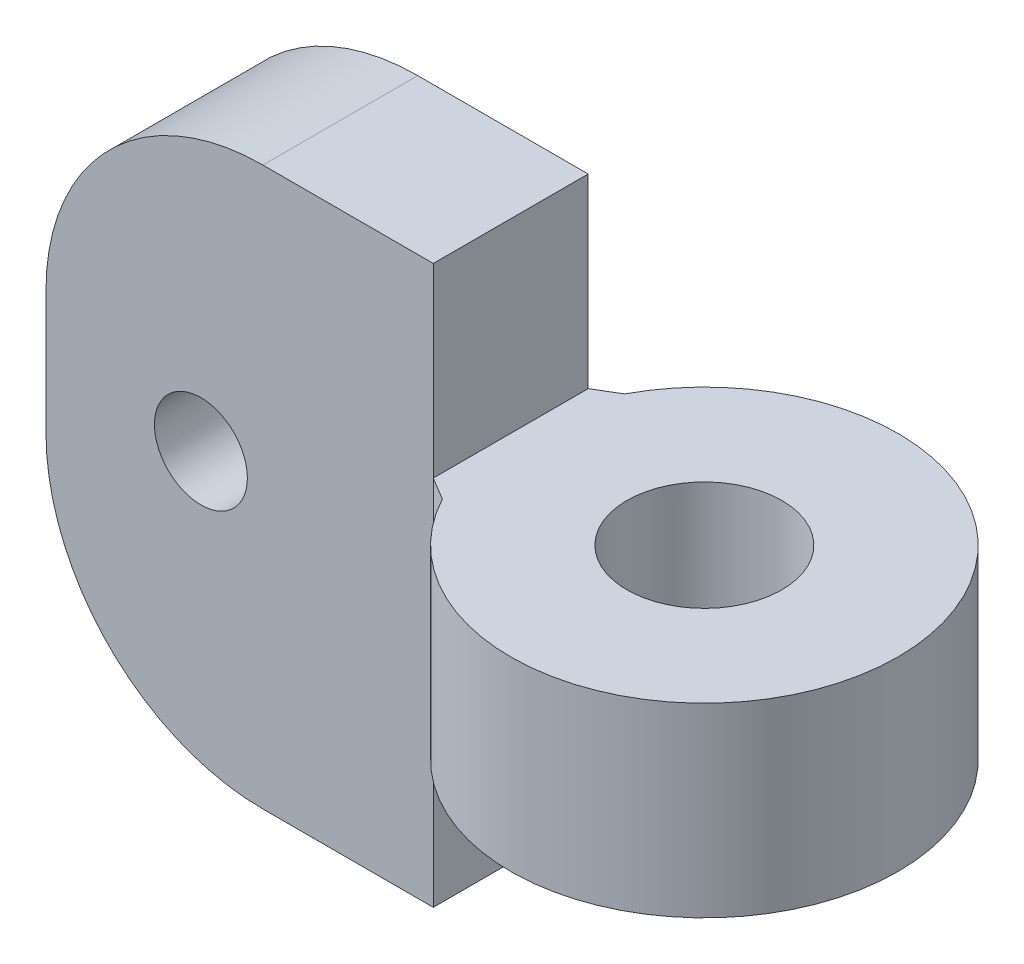
ISO-10303-21;
HEADER;
FILE_DESCRIPTION(('STEP AP214'),'2;1');
FILE_NAME('part.step','',(''),(''),'','','');
FILE_SCHEMA(('AUTOMOTIVE_DESIGN { 1 0 10303 214 1 1 1 1 }'));
ENDSEC;
DATA;
#1=APPLICATION_CONTEXT('core data for automotive mechanical design processes');
#2=APPLICATION_PROTOCOL_DEFINITION('international standard','automotive_design',2000,#1);
#3=PRODUCT_CONTEXT('',#1,'mechanical');
#4=PRODUCT('Part','Part','',(#3));
#5=PRODUCT_RELATED_PRODUCT_CATEGORY('part','',(#4));
#6=PRODUCT_DEFINITION_FORMATION('','',#4);
#7=PRODUCT_DEFINITION_CONTEXT('part definition',#1,'design');
#8=PRODUCT_DEFINITION('design','',#6,#7);
#9=PRODUCT_DEFINITION_SHAPE('','',#8);
#10=(LENGTH_UNIT() NAMED_UNIT(*) SI_UNIT(.MILLI.,.METRE.));
#11=(NAMED_UNIT(*) PLANE_ANGLE_UNIT() SI_UNIT($,.RADIAN.));
#12=(NAMED_UNIT(*) SI_UNIT($,.STERADIAN.) SOLID_ANGLE_UNIT());
#13=UNCERTAINTY_MEASURE_WITH_UNIT(LENGTH_MEASURE(1.E-05),#10,'distance_accuracy_value','');
#14=(GEOMETRIC_REPRESENTATION_CONTEXT(3) GLOBAL_UNCERTAINTY_ASSIGNED_CONTEXT((#13)) GLOBAL_UNIT_ASSIGNED_CONTEXT((#10,
#11,#12)) REPRESENTATION_CONTEXT('',''));
#15=CARTESIAN_POINT('',(0.,0.,0.));
#16=DIRECTION('',(0.,0.,1.));
#17=DIRECTION('',(1.,0.,0.));
#18=AXIS2_PLACEMENT_3D('',#15,#16,#17);
#19=CARTESIAN_POINT('',(11.25,5.1,15.));
#20=DIRECTION('',(-1.,0.,0.));
#21=DIRECTION('',(0.,0.,1.));
#22=AXIS2_PLACEMENT_3D('',#19,#20,#21);
#23=PLANE('',#22);
#24=DIRECTION('',(0.,1.,0.));
#25=VECTOR('',#24,1.);
#26=CARTESIAN_POINT('',(11.25,-4.9,5.));
#27=LINE('',#26,#25);
#28=CARTESIAN_POINT('',(11.25,-0.9,5.));
#29=VERTEX_POINT('',#28);
#30=CARTESIAN_POINT('',(11.25,5.1,5.));
#31=VERTEX_POINT('',#30);
#32=EDGE_CURVE('E157',#29,#31,#27,.T.);
#33=ORIENTED_EDGE('',*,*,#32,.T.);
#34=DIRECTION('',(0.,0.,-1.));
#35=VECTOR('',#34,1.);
#36=CARTESIAN_POINT('',(11.25,5.1,15.));
#37=LINE('',#36,#35);
#38=CARTESIAN_POINT('',(11.25,5.1,10.));
#39=VERTEX_POINT('',#38);
#40=EDGE_CURVE('E174',#39,#31,#37,.T.);
#41=ORIENTED_EDGE('',*,*,#40,.F.);
#42=DIRECTION('',(0.,1.,0.));
#43=VECTOR('',#42,1.);
#44=CARTESIAN_POINT('',(11.25,-4.9,10.));
#45=LINE('',#44,#43);
#46=CARTESIAN_POINT('',(11.25,-0.9,10.));
#47=VERTEX_POINT('',#46);
#48=EDGE_CURVE('E208',#47,#39,#45,.T.);
#49=ORIENTED_EDGE('',*,*,#48,.F.);
#50=DIRECTION('',(0.,0.,-1.));
#51=VECTOR('',#50,1.);
#52=CARTESIAN_POINT('',(11.25,-0.9,15.));
#53=LINE('',#52,#51);
#54=EDGE_CURVE('E183',#47,#29,#53,.T.);
#55=ORIENTED_EDGE('',*,*,#54,.T.);
#56=EDGE_LOOP('',(#33,#41,#49,#55));
#57=FACE_BOUND('',#56,.T.);
#58=ADVANCED_FACE('F69',(#57),#23,.F.);
#59=CARTESIAN_POINT('',(11.25,17.1,15.));
#60=DIRECTION('',(-1.,0.,0.));
#61=DIRECTION('',(0.,-1.,0.));
#62=AXIS2_PLACEMENT_3D('',#59,#60,#61);
#63=PLANE('',#62);
#64=CARTESIAN_POINT('',(11.25,11.1,5.));
#65=VERTEX_POINT('',#64);
#66=CARTESIAN_POINT('',(11.25,17.1,5.));
#67=VERTEX_POINT('',#66);
#68=EDGE_CURVE('E148',#65,#67,#27,.T.);
#69=ORIENTED_EDGE('',*,*,#68,.T.);
#70=DIRECTION('',(0.,0.,-1.));
#71=VECTOR('',#70,1.);
#72=CARTESIAN_POINT('',(11.25,17.1,15.));
#73=LINE('',#72,#71);
#74=CARTESIAN_POINT('',(11.25,17.1,10.));
#75=VERTEX_POINT('',#74);
#76=EDGE_CURVE('E164',#75,#67,#73,.T.);
#77=ORIENTED_EDGE('',*,*,#76,.F.);
#78=CARTESIAN_POINT('',(11.25,11.1,10.));
#79=VERTEX_POINT('',#78);
#80=EDGE_CURVE('E217',#79,#75,#45,.T.);
#81=ORIENTED_EDGE('',*,*,#80,.F.);
#82=DIRECTION('',(0.,0.,-1.));
#83=VECTOR('',#82,1.);
#84=CARTESIAN_POINT('',(11.25,11.1,15.));
#85=LINE('',#84,#83);
#86=EDGE_CURVE('E166',#79,#65,#85,.T.);
#87=ORIENTED_EDGE('',*,*,#86,.T.);
#88=EDGE_LOOP('',(#69,#77,#81,#87));
#89=FACE_BOUND('',#88,.T.);
#90=ADVANCED_FACE('F162',(#89),#63,.F.);
#91=CARTESIAN_POINT('',(23.75,5.1,15.));
#92=DIRECTION('',(0.,1.,0.));
#93=DIRECTION('',(-1.,0.,0.));
#94=AXIS2_PLACEMENT_3D('',#91,#92,#93);
#95=PLANE('',#94);
#96=CARTESIAN_POINT('',(17.5,5.1,7.5));
#97=DIRECTION('',(0.,1.,0.));
#98=DIRECTION('',(-1.,0.,0.));
#99=AXIS2_PLACEMENT_3D('',#96,#97,#98);
#100=CIRCLE('',#99,2.5);
#101=CARTESIAN_POINT('',(15.,5.1,7.5));
#102=VERTEX_POINT('',#101);
#103=EDGE_CURVE('E172',#102,#102,#100,.F.);
#104=ORIENTED_EDGE('',*,*,#103,.F.);
#105=EDGE_LOOP('',(#104));
#106=FACE_BOUND('',#105,.T.);
#107=DIRECTION('',(-0.857492925712544,0.,0.514495755427527));
#108=VECTOR('',#107,1.);
#109=CARTESIAN_POINT('',(16.0294117647059,5.1,2.13235294117647));
#110=LINE('',#109,#108);
#111=CARTESIAN_POINT('',(11.985294117647,5.1,4.55882352941178));
#112=VERTEX_POINT('',#111);
#113=EDGE_CURVE('E156',#112,#31,#110,.T.);
#114=ORIENTED_EDGE('',*,*,#113,.F.);
#115=CARTESIAN_POINT('',(17.5,5.1,7.5));
#116=DIRECTION('',(0.,1.,0.));
#117=DIRECTION('',(-1.,0.,0.));
#118=AXIS2_PLACEMENT_3D('',#115,#116,#117);
#119=CIRCLE('',#118,6.25);
#120=CARTESIAN_POINT('',(11.9852941176471,5.1,10.4411764705882));
#121=VERTEX_POINT('',#120);
#122=EDGE_CURVE('E198',#121,#112,#119,.T.);
#123=ORIENTED_EDGE('',*,*,#122,.F.);
#124=DIRECTION('',(-0.857492925712545,0.,-0.514495755427524));
#125=VECTOR('',#124,1.);
#126=CARTESIAN_POINT('',(22.6470588235294,5.1,16.8382352941176));
#127=LINE('',#126,#125);
#128=EDGE_CURVE('E226',#121,#39,#127,.T.);
#129=ORIENTED_EDGE('',*,*,#128,.T.);
#130=ORIENTED_EDGE('',*,*,#40,.T.);
#131=EDGE_LOOP('',(#114,#123,#129,#130));
#132=FACE_BOUND('',#131,.T.);
#133=ADVANCED_FACE('F240',(#106,#132),#95,.F.);
#134=CARTESIAN_POINT('',(11.25,11.1,15.));
#135=DIRECTION('',(0.,-1.,0.));
#136=DIRECTION('',(0.,0.,-1.));
#137=AXIS2_PLACEMENT_3D('',#134,#135,#136);
#138=PLANE('',#137);
#139=CARTESIAN_POINT('',(17.5,11.1,7.5));
#140=DIRECTION('',(0.,-1.,0.));
#141=DIRECTION('',(0.,0.,-1.));
#142=AXIS2_PLACEMENT_3D('',#139,#140,#141);
#143=CIRCLE('',#142,2.5);
#144=CARTESIAN_POINT('',(17.5,11.1,5.));
#145=VERTEX_POINT('',#144);
#146=EDGE_CURVE('E177',#145,#145,#143,.F.);
#147=ORIENTED_EDGE('',*,*,#146,.F.);
#148=EDGE_LOOP('',(#147));
#149=FACE_BOUND('',#148,.T.);
#150=DIRECTION('',(0.857492925712544,0.,-0.514495755427527));
#151=VECTOR('',#150,1.);
#152=CARTESIAN_POINT('',(6.83823529411765,11.1,7.64705882352942));
#153=LINE('',#152,#151);
#154=CARTESIAN_POINT('',(11.985294117647,11.1,4.55882352941178));
#155=VERTEX_POINT('',#154);
#156=EDGE_CURVE('E12',#65,#155,#153,.T.);
#157=ORIENTED_EDGE('',*,*,#156,.F.);
#158=ORIENTED_EDGE('',*,*,#86,.F.);
#159=DIRECTION('',(0.857492925712546,0.,0.514495755427524));
#160=VECTOR('',#159,1.);
#161=CARTESIAN_POINT('',(13.4558823529412,11.1,11.3235294117647));
#162=LINE('',#161,#160);
#163=CARTESIAN_POINT('',(11.9852941176471,11.1,10.4411764705882));
#164=VERTEX_POINT('',#163);
#165=EDGE_CURVE('E224',#79,#164,#162,.T.);
#166=ORIENTED_EDGE('',*,*,#165,.T.);
#167=CARTESIAN_POINT('',(17.5,11.1,7.5));
#168=DIRECTION('',(0.,-1.,0.));
#169=DIRECTION('',(0.,0.,-1.));
#170=AXIS2_PLACEMENT_3D('',#167,#168,#169);
#171=CIRCLE('',#170,6.25);
#172=EDGE_CURVE('E229',#155,#164,#171,.T.);
#173=ORIENTED_EDGE('',*,*,#172,.F.);
#174=EDGE_LOOP('',(#157,#158,#166,#173));
#175=FACE_BOUND('',#174,.T.);
#176=ADVANCED_FACE('F273',(#149,#175),#138,.F.);
#177=CARTESIAN_POINT('',(5.75000000000005,17.1,15.));
#178=DIRECTION('',(0.,-1.,0.));
#179=DIRECTION('',(0.,0.,-1.));
#180=AXIS2_PLACEMENT_3D('',#177,#178,#179);
#181=PLANE('',#180);
#182=ORIENTED_EDGE('',*,*,#76,.T.);
#183=DIRECTION('',(1.,0.,0.));
#184=VECTOR('',#183,1.);
#185=CARTESIAN_POINT('',(0.,17.1,5.));
#186=LINE('',#185,#184);
#187=CARTESIAN_POINT('',(5.75,17.1,5.));
#188=VERTEX_POINT('',#187);
#189=EDGE_CURVE('E144',#188,#67,#186,.T.);
#190=ORIENTED_EDGE('',*,*,#189,.F.);
#191=DIRECTION('',(0.,0.,-1.));
#192=VECTOR('',#191,1.);
#193=CARTESIAN_POINT('',(5.75000000000005,17.1,15.));
#194=LINE('',#193,#192);
#195=CARTESIAN_POINT('',(5.75,17.1,10.));
#196=VERTEX_POINT('',#195);
#197=EDGE_CURVE('E78',#196,#188,#194,.T.);
#198=ORIENTED_EDGE('',*,*,#197,.F.);
#199=DIRECTION('',(1.,0.,0.));
#200=VECTOR('',#199,1.);
#201=CARTESIAN_POINT('',(0.,17.1,10.));
#202=LINE('',#201,#200);
#203=EDGE_CURVE('E171',#196,#75,#202,.T.);
#204=ORIENTED_EDGE('',*,*,#203,.T.);
#205=EDGE_LOOP('',(#182,#190,#198,#204));
#206=FACE_BOUND('',#205,.T.);
#207=ADVANCED_FACE('F71',(#206),#181,.F.);
#208=CARTESIAN_POINT('',(5.75,10.1,15.));
#209=DIRECTION('',(0.,0.,-1.));
#210=DIRECTION('',(-1.,0.,0.));
#211=AXIS2_PLACEMENT_3D('',#208,#209,#210);
#212=CYLINDRICAL_SURFACE('',#211,7.);
#213=ORIENTED_EDGE('',*,*,#197,.T.);
#214=CARTESIAN_POINT('',(5.75,10.1,5.));
#215=DIRECTION('',(0.,0.,1.));
#216=DIRECTION('',(1.,0.,0.));
#217=AXIS2_PLACEMENT_3D('',#214,#215,#216);
#218=CIRCLE('',#217,7.);
#219=CARTESIAN_POINT('',(-1.25,10.1,5.));
#220=VERTEX_POINT('',#219);
#221=EDGE_CURVE('E151',#188,#220,#218,.T.);
#222=ORIENTED_EDGE('',*,*,#221,.T.);
#223=DIRECTION('',(0.,0.,-1.));
#224=VECTOR('',#223,1.);
#225=CARTESIAN_POINT('',(-1.25,10.1,15.));
#226=LINE('',#225,#224);
#227=CARTESIAN_POINT('',(-1.25,10.1,10.));
#228=VERTEX_POINT('',#227);
#229=EDGE_CURVE('E192',#228,#220,#226,.T.);
#230=ORIENTED_EDGE('',*,*,#229,.F.);
#231=CARTESIAN_POINT('',(5.75,10.1,10.));
#232=DIRECTION('',(0.,0.,1.));
#233=DIRECTION('',(1.,0.,0.));
#234=AXIS2_PLACEMENT_3D('',#231,#232,#233);
#235=CIRCLE('',#234,7.);
#236=EDGE_CURVE('E85',#196,#228,#235,.T.);
#237=ORIENTED_EDGE('',*,*,#236,.F.);
#238=EDGE_LOOP('',(#213,#222,#230,#237));
#239=FACE_BOUND('',#238,.T.);
#240=ADVANCED_FACE('F255',(#239),#212,.T.);
#241=CARTESIAN_POINT('',(-1.25,6.10000000000005,15.));
#242=DIRECTION('',(1.,0.,0.));
#243=DIRECTION('',(0.,0.,-1.));
#244=AXIS2_PLACEMENT_3D('',#241,#242,#243);
#245=PLANE('',#244);
#246=ORIENTED_EDGE('',*,*,#229,.T.);
#247=DIRECTION('',(0.,-1.,0.));
#248=VECTOR('',#247,1.);
#249=CARTESIAN_POINT('',(-1.25,6.10000000000005,5.));
#250=LINE('',#249,#248);
#251=CARTESIAN_POINT('',(-1.25,6.10000000000005,5.));
#252=VERTEX_POINT('',#251);
#253=EDGE_CURVE('E251',#220,#252,#250,.T.);
#254=ORIENTED_EDGE('',*,*,#253,.T.);
#255=DIRECTION('',(0.,0.,-1.));
#256=VECTOR('',#255,1.);
#257=CARTESIAN_POINT('',(-1.25,6.10000000000005,15.));
#258=LINE('',#257,#256);
#259=CARTESIAN_POINT('',(-1.25,6.10000000000005,10.));
#260=VERTEX_POINT('',#259);
#261=EDGE_CURVE('E189',#260,#252,#258,.T.);
#262=ORIENTED_EDGE('',*,*,#261,.F.);
#263=DIRECTION('',(0.,-1.,0.));
#264=VECTOR('',#263,1.);
#265=CARTESIAN_POINT('',(-1.25,6.10000000000005,10.));
#266=LINE('',#265,#264);
#267=EDGE_CURVE('E89',#228,#260,#266,.T.);
#268=ORIENTED_EDGE('',*,*,#267,.F.);
#269=EDGE_LOOP('',(#246,#254,#262,#268));
#270=FACE_BOUND('',#269,.T.);
#271=ADVANCED_FACE('F257',(#270),#245,.F.);
#272=CARTESIAN_POINT('',(5.75,6.1,15.));
#273=DIRECTION('',(0.,0.,-1.));
#274=DIRECTION('',(-1.,0.,0.));
#275=AXIS2_PLACEMENT_3D('',#272,#273,#274);
#276=CYLINDRICAL_SURFACE('',#275,7.);
#277=ORIENTED_EDGE('',*,*,#261,.T.);
#278=CARTESIAN_POINT('',(5.75,6.1,5.));
#279=DIRECTION('',(0.,0.,1.));
#280=DIRECTION('',(1.,0.,0.));
#281=AXIS2_PLACEMENT_3D('',#278,#279,#280);
#282=CIRCLE('',#281,7.);
#283=CARTESIAN_POINT('',(5.75000000000005,-0.9,5.));
#284=VERTEX_POINT('',#283);
#285=EDGE_CURVE('E248',#252,#284,#282,.T.);
#286=ORIENTED_EDGE('',*,*,#285,.T.);
#287=DIRECTION('',(0.,0.,-1.));
#288=VECTOR('',#287,1.);
#289=CARTESIAN_POINT('',(5.75000000000005,-0.9,15.));
#290=LINE('',#289,#288);
#291=CARTESIAN_POINT('',(5.75000000000005,-0.9,10.));
#292=VERTEX_POINT('',#291);
#293=EDGE_CURVE('E186',#292,#284,#290,.T.);
#294=ORIENTED_EDGE('',*,*,#293,.F.);
#295=CARTESIAN_POINT('',(5.75,6.1,10.));
#296=DIRECTION('',(0.,0.,1.));
#297=DIRECTION('',(1.,0.,0.));
#298=AXIS2_PLACEMENT_3D('',#295,#296,#297);
#299=CIRCLE('',#298,7.);
#300=EDGE_CURVE('E205',#260,#292,#299,.T.);
#301=ORIENTED_EDGE('',*,*,#300,.F.);
#302=EDGE_LOOP('',(#277,#286,#294,#301));
#303=FACE_BOUND('',#302,.T.);
#304=ADVANCED_FACE('F260',(#303),#276,.T.);
#305=CARTESIAN_POINT('',(5.75000000000005,-0.9,15.));
#306=DIRECTION('',(0.,1.,0.));
#307=DIRECTION('',(0.,0.,1.));
#308=AXIS2_PLACEMENT_3D('',#305,#306,#307);
#309=PLANE('',#308);
#310=ORIENTED_EDGE('',*,*,#293,.T.);
#311=DIRECTION('',(1.,0.,0.));
#312=VECTOR('',#311,1.);
#313=CARTESIAN_POINT('',(5.75000000000005,-0.9,5.));
#314=LINE('',#313,#312);
#315=EDGE_CURVE('E244',#284,#29,#314,.T.);
#316=ORIENTED_EDGE('',*,*,#315,.T.);
#317=ORIENTED_EDGE('',*,*,#54,.F.);
#318=DIRECTION('',(1.,0.,0.));
#319=VECTOR('',#318,1.);
#320=CARTESIAN_POINT('',(5.75000000000005,-0.9,10.));
#321=LINE('',#320,#319);
#322=EDGE_CURVE('E201',#292,#47,#321,.T.);
#323=ORIENTED_EDGE('',*,*,#322,.F.);
#324=EDGE_LOOP('',(#310,#316,#317,#323));
#325=FACE_BOUND('',#324,.T.);
#326=ADVANCED_FACE('F267',(#325),#309,.F.);
#327=CARTESIAN_POINT('',(3.75,8.1,15.));
#328=DIRECTION('',(0.,0.,-1.));
#329=DIRECTION('',(-1.,0.,0.));
#330=AXIS2_PLACEMENT_3D('',#327,#328,#329);
#331=CYLINDRICAL_SURFACE('',#330,1.5);
#332=CARTESIAN_POINT('',(3.75,8.1,5.));
#333=DIRECTION('',(0.,0.,1.));
#334=DIRECTION('',(1.,0.,0.));
#335=AXIS2_PLACEMENT_3D('',#332,#333,#334);
#336=CIRCLE('',#335,1.5);
#337=CARTESIAN_POINT('',(5.25,8.1,5.));
#338=VERTEX_POINT('',#337);
#339=EDGE_CURVE('E73',#338,#338,#336,.T.);
#340=ORIENTED_EDGE('',*,*,#339,.F.);
#341=EDGE_LOOP('',(#340));
#342=FACE_BOUND('',#341,.T.);
#343=CARTESIAN_POINT('',(3.75,8.1,10.));
#344=DIRECTION('',(0.,0.,1.));
#345=DIRECTION('',(1.,0.,0.));
#346=AXIS2_PLACEMENT_3D('',#343,#344,#345);
#347=CIRCLE('',#346,1.5);
#348=CARTESIAN_POINT('',(5.25,8.1,10.));
#349=VERTEX_POINT('',#348);
#350=EDGE_CURVE('E199',#349,#349,#347,.T.);
#351=ORIENTED_EDGE('',*,*,#350,.T.);
#352=EDGE_LOOP('',(#351));
#353=FACE_BOUND('',#352,.T.);
#354=ADVANCED_FACE('F293',(#342,#353),#331,.F.);
#355=CARTESIAN_POINT('',(17.5,20.,7.5));
#356=DIRECTION('',(0.,-1.,0.));
#357=DIRECTION('',(0.,0.,-1.));
#358=AXIS2_PLACEMENT_3D('',#355,#356,#357);
#359=CYLINDRICAL_SURFACE('',#358,2.5);
#360=ORIENTED_EDGE('',*,*,#146,.T.);
#361=EDGE_LOOP('',(#360));
#362=FACE_BOUND('',#361,.T.);
#363=ORIENTED_EDGE('',*,*,#103,.T.);
#364=EDGE_LOOP('',(#363));
#365=FACE_BOUND('',#364,.T.);
#366=ADVANCED_FACE('F320',(#362,#365),#359,.F.);
#367=CARTESIAN_POINT('',(17.5,20.,7.5));
#368=DIRECTION('',(0.,-1.,0.));
#369=DIRECTION('',(0.,0.,-1.));
#370=AXIS2_PLACEMENT_3D('',#367,#368,#369);
#371=CYLINDRICAL_SURFACE('',#370,6.25);
#372=ORIENTED_EDGE('',*,*,#122,.T.);
#373=DIRECTION('',(0.,1.,0.));
#374=VECTOR('',#373,1.);
#375=CARTESIAN_POINT('',(11.985294117647,-4.9,4.55882352941178));
#376=LINE('',#375,#374);
#377=EDGE_CURVE('E168',#112,#155,#376,.T.);
#378=ORIENTED_EDGE('',*,*,#377,.T.);
#379=ORIENTED_EDGE('',*,*,#172,.T.);
#380=DIRECTION('',(0.,1.,0.));
#381=VECTOR('',#380,1.);
#382=CARTESIAN_POINT('',(11.9852941176471,-4.9,10.4411764705882));
#383=LINE('',#382,#381);
#384=EDGE_CURVE('E202',#121,#164,#383,.T.);
#385=ORIENTED_EDGE('',*,*,#384,.F.);
#386=EDGE_LOOP('',(#372,#378,#379,#385));
#387=FACE_BOUND('',#386,.T.);
#388=ADVANCED_FACE('F233',(#387),#371,.T.);
#389=CARTESIAN_POINT('',(-1.43382352941178,-4.9,2.38970588235298));
#390=DIRECTION('',(0.514495755427524,0.,-0.857492925712546));
#391=DIRECTION('',(-0.857492925712546,0.,-0.514495755427524));
#392=AXIS2_PLACEMENT_3D('',#389,#390,#391);
#393=PLANE('',#392);
#394=ORIENTED_EDGE('',*,*,#384,.T.);
#395=ORIENTED_EDGE('',*,*,#165,.F.);
#396=EDGE_CURVE('E215',#39,#79,#45,.T.);
#397=ORIENTED_EDGE('',*,*,#396,.F.);
#398=ORIENTED_EDGE('',*,*,#128,.F.);
#399=EDGE_LOOP('',(#394,#395,#397,#398));
#400=FACE_BOUND('',#399,.T.);
#401=ADVANCED_FACE('F271',(#400),#393,.F.);
#402=CARTESIAN_POINT('',(0.,-4.9,10.));
#403=DIRECTION('',(0.,0.,1.));
#404=DIRECTION('',(1.,0.,0.));
#405=AXIS2_PLACEMENT_3D('',#402,#403,#404);
#406=PLANE('',#405);
#407=ORIENTED_EDGE('',*,*,#350,.F.);
#408=EDGE_LOOP('',(#407));
#409=FACE_BOUND('',#408,.T.);
#410=ORIENTED_EDGE('',*,*,#236,.T.);
#411=ORIENTED_EDGE('',*,*,#267,.T.);
#412=ORIENTED_EDGE('',*,*,#300,.T.);
#413=ORIENTED_EDGE('',*,*,#322,.T.);
#414=ORIENTED_EDGE('',*,*,#48,.T.);
#415=ORIENTED_EDGE('',*,*,#396,.T.);
#416=ORIENTED_EDGE('',*,*,#80,.T.);
#417=ORIENTED_EDGE('',*,*,#203,.F.);
#418=EDGE_LOOP('',(#410,#411,#412,#413,#414,#415,#416,#417));
#419=FACE_BOUND('',#418,.T.);
#420=ADVANCED_FACE('F263',(#409,#419),#406,.T.);
#421=CARTESIAN_POINT('',(0.,-4.9,5.));
#422=DIRECTION('',(0.,0.,1.));
#423=DIRECTION('',(1.,0.,0.));
#424=AXIS2_PLACEMENT_3D('',#421,#422,#423);
#425=PLANE('',#424);
#426=ORIENTED_EDGE('',*,*,#339,.T.);
#427=EDGE_LOOP('',(#426));
#428=FACE_BOUND('',#427,.T.);
#429=ORIENTED_EDGE('',*,*,#189,.T.);
#430=ORIENTED_EDGE('',*,*,#68,.F.);
#431=EDGE_CURVE('E167',#31,#65,#27,.T.);
#432=ORIENTED_EDGE('',*,*,#431,.F.);
#433=ORIENTED_EDGE('',*,*,#32,.F.);
#434=ORIENTED_EDGE('',*,*,#315,.F.);
#435=ORIENTED_EDGE('',*,*,#285,.F.);
#436=ORIENTED_EDGE('',*,*,#253,.F.);
#437=ORIENTED_EDGE('',*,*,#221,.F.);
#438=EDGE_LOOP('',(#429,#430,#432,#433,#434,#435,#436,#437));
#439=FACE_BOUND('',#438,.T.);
#440=ADVANCED_FACE('F146',(#428,#439),#425,.F.);
#441=CARTESIAN_POINT('',(5.18382352941177,-4.9,8.63970588235294));
#442=DIRECTION('',(-0.514495755427527,0.,-0.857492925712544));
#443=DIRECTION('',(-0.857492925712544,0.,0.514495755427527));
#444=AXIS2_PLACEMENT_3D('',#441,#442,#443);
#445=PLANE('',#444);
#446=ORIENTED_EDGE('',*,*,#113,.T.);
#447=ORIENTED_EDGE('',*,*,#431,.T.);
#448=ORIENTED_EDGE('',*,*,#156,.T.);
#449=ORIENTED_EDGE('',*,*,#377,.F.);
#450=EDGE_LOOP('',(#446,#447,#448,#449));
#451=FACE_BOUND('',#450,.T.);
#452=ADVANCED_FACE('F237',(#451),#445,.T.);
#453=CLOSED_SHELL('',(#58,#90,#133,#176,#207,#240,#271,#304,#326,#354,#366,#388,#401,#420,#440,#452));
#454=MANIFOLD_SOLID_BREP('B2',#453);
#455=ADVANCED_BREP_SHAPE_REPRESENTATION('',(#18,#454),#14);
#456=SHAPE_DEFINITION_REPRESENTATION(#9,#455);
ENDSEC;
END-ISO-10303-21;
